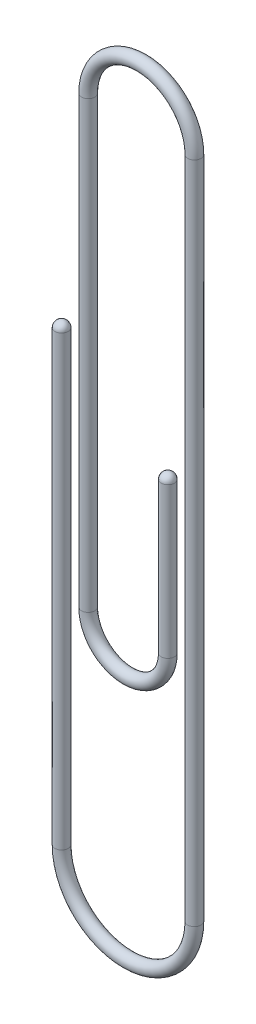
ISO-10303-21;
HEADER;
FILE_DESCRIPTION(('STEP AP214'),'2;1');
FILE_NAME('part.step','',(''),(''),'','','');
FILE_SCHEMA(('AUTOMOTIVE_DESIGN { 1 0 10303 214 1 1 1 1 }'));
ENDSEC;
DATA;
#1=APPLICATION_CONTEXT('core data for automotive mechanical design processes');
#2=APPLICATION_PROTOCOL_DEFINITION('international standard','automotive_design',2000,#1);
#3=PRODUCT_CONTEXT('',#1,'mechanical');
#4=PRODUCT('Part','Part','',(#3));
#5=PRODUCT_RELATED_PRODUCT_CATEGORY('part','',(#4));
#6=PRODUCT_DEFINITION_FORMATION('','',#4);
#7=PRODUCT_DEFINITION_CONTEXT('part definition',#1,'design');
#8=PRODUCT_DEFINITION('design','',#6,#7);
#9=PRODUCT_DEFINITION_SHAPE('','',#8);
#10=(LENGTH_UNIT() NAMED_UNIT(*) SI_UNIT(.MILLI.,.METRE.));
#11=(NAMED_UNIT(*) PLANE_ANGLE_UNIT() SI_UNIT($,.RADIAN.));
#12=(NAMED_UNIT(*) SI_UNIT($,.STERADIAN.) SOLID_ANGLE_UNIT());
#13=UNCERTAINTY_MEASURE_WITH_UNIT(LENGTH_MEASURE(1.E-05),#10,'distance_accuracy_value','');
#14=(GEOMETRIC_REPRESENTATION_CONTEXT(3) GLOBAL_UNCERTAINTY_ASSIGNED_CONTEXT((#13)) GLOBAL_UNIT_ASSIGNED_CONTEXT((#10,
#11,#12)) REPRESENTATION_CONTEXT('',''));
#15=CARTESIAN_POINT('',(0.,0.,0.));
#16=DIRECTION('',(0.,0.,1.));
#17=DIRECTION('',(1.,0.,0.));
#18=AXIS2_PLACEMENT_3D('',#15,#16,#17);
#19=CARTESIAN_POINT('',(-2.,-20.0269196464769,0.));
#20=DIRECTION('',(0.,-1.,0.));
#21=DIRECTION('',(0.,0.,-1.));
#22=AXIS2_PLACEMENT_3D('',#19,#20,#21);
#23=CYLINDRICAL_SURFACE('',#22,0.5);
#24=CARTESIAN_POINT('',(-2.,-20.5269196464769,0.));
#25=DIRECTION('',(0.,-1.,0.));
#26=DIRECTION('',(0.,0.,-1.));
#27=AXIS2_PLACEMENT_3D('',#24,#25,#26);
#28=CIRCLE('',#27,0.5);
#29=CARTESIAN_POINT('',(-2.,-20.5269196464769,-0.5));
#30=VERTEX_POINT('',#29);
#31=EDGE_CURVE('E56',#30,#30,#28,.T.);
#32=ORIENTED_EDGE('',*,*,#31,.T.);
#33=EDGE_LOOP('',(#32));
#34=FACE_BOUND('',#33,.T.);
#35=CARTESIAN_POINT('',(-2.,-31.8534014432822,0.));
#36=DIRECTION('',(0.,1.,0.));
#37=DIRECTION('',(0.,0.,-1.));
#38=AXIS2_PLACEMENT_3D('',#35,#36,#37);
#39=CIRCLE('',#38,0.5);
#40=CARTESIAN_POINT('',(-1.5,-31.8534014432822,0.));
#41=VERTEX_POINT('',#40);
#42=EDGE_CURVE('E78',#41,#41,#39,.T.);
#43=ORIENTED_EDGE('',*,*,#42,.T.);
#44=EDGE_LOOP('',(#43));
#45=FACE_BOUND('',#44,.T.);
#46=ADVANCED_FACE('F49',(#34,#45),#23,.T.);
#47=CARTESIAN_POINT('',(-5.,-31.8534014432822,0.));
#48=DIRECTION('',(0.,0.,-1.));
#49=DIRECTION('',(-1.,0.,0.));
#50=AXIS2_PLACEMENT_3D('',#47,#48,#49);
#51=TOROIDAL_SURFACE('',#50,3.,0.5);
#52=CARTESIAN_POINT('',(-8.,-31.8534014432822,0.));
#53=DIRECTION('',(0.,-1.,0.));
#54=DIRECTION('',(0.,0.,-1.));
#55=AXIS2_PLACEMENT_3D('',#52,#53,#54);
#56=CIRCLE('',#55,0.5);
#57=CARTESIAN_POINT('',(-8.5,-31.8534014432822,0.));
#58=VERTEX_POINT('',#57);
#59=EDGE_CURVE('E75',#58,#58,#56,.T.);
#60=CARTESIAN_POINT('',(-5.,-31.8534014432822,0.));
#61=DIRECTION('',(0.,0.,-1.));
#62=DIRECTION('',(-1.,0.,0.));
#63=AXIS2_PLACEMENT_3D('',#60,#61,#62);
#64=CIRCLE('',#63,3.5);
#65=EDGE_CURVE('',#41,#58,#64,.T.);
#66=ORIENTED_EDGE('',*,*,#42,.F.);
#67=ORIENTED_EDGE('',*,*,#59,.T.);
#68=ORIENTED_EDGE('',*,*,#65,.T.);
#69=ORIENTED_EDGE('',*,*,#65,.F.);
#70=EDGE_LOOP('',(#66,#68,#67,#69));
#71=FACE_BOUND('',#70,.T.);
#72=ADVANCED_FACE('F83',(#71),#51,.T.);
#73=CARTESIAN_POINT('',(-8.,-31.8534014432822,0.));
#74=DIRECTION('',(0.,1.,0.));
#75=DIRECTION('',(0.,0.,1.));
#76=AXIS2_PLACEMENT_3D('',#73,#74,#75);
#77=CYLINDRICAL_SURFACE('',#76,0.5);
#78=CARTESIAN_POINT('',(-8.,1.65157019315808,0.));
#79=DIRECTION('',(0.,-1.,0.));
#80=DIRECTION('',(0.,0.,-1.));
#81=AXIS2_PLACEMENT_3D('',#78,#79,#80);
#82=CIRCLE('',#81,0.5);
#83=CARTESIAN_POINT('',(-8.5,1.65157019315808,0.));
#84=VERTEX_POINT('',#83);
#85=EDGE_CURVE('E72',#84,#84,#82,.T.);
#86=ORIENTED_EDGE('',*,*,#85,.T.);
#87=EDGE_LOOP('',(#86));
#88=FACE_BOUND('',#87,.T.);
#89=ORIENTED_EDGE('',*,*,#59,.F.);
#90=EDGE_LOOP('',(#89));
#91=FACE_BOUND('',#90,.T.);
#92=ADVANCED_FACE('F85',(#88,#91),#77,.T.);
#93=CARTESIAN_POINT('',(-4.,1.65157019315808,0.));
#94=DIRECTION('',(0.,0.,-1.));
#95=DIRECTION('',(-1.,0.,0.));
#96=AXIS2_PLACEMENT_3D('',#93,#94,#95);
#97=TOROIDAL_SURFACE('',#96,4.,0.5);
#98=CARTESIAN_POINT('',(0.,1.65157019315808,0.));
#99=DIRECTION('',(0.,1.,0.));
#100=DIRECTION('',(0.,0.,-1.));
#101=AXIS2_PLACEMENT_3D('',#98,#99,#100);
#102=CIRCLE('',#101,0.5);
#103=CARTESIAN_POINT('',(0.500000000000004,1.65157019315808,0.));
#104=VERTEX_POINT('',#103);
#105=EDGE_CURVE('E69',#104,#104,#102,.T.);
#106=CARTESIAN_POINT('',(-4.,1.65157019315808,0.));
#107=DIRECTION('',(0.,0.,-1.));
#108=DIRECTION('',(-1.,0.,0.));
#109=AXIS2_PLACEMENT_3D('',#106,#107,#108);
#110=CIRCLE('',#109,4.5);
#111=EDGE_CURVE('',#84,#104,#110,.T.);
#112=ORIENTED_EDGE('',*,*,#85,.F.);
#113=ORIENTED_EDGE('',*,*,#105,.T.);
#114=ORIENTED_EDGE('',*,*,#111,.T.);
#115=ORIENTED_EDGE('',*,*,#111,.F.);
#116=EDGE_LOOP('',(#112,#114,#113,#115));
#117=FACE_BOUND('',#116,.T.);
#118=ADVANCED_FACE('F91',(#117),#97,.T.);
#119=CARTESIAN_POINT('',(0.,1.65157019315808,0.));
#120=DIRECTION('',(0.,-1.,0.));
#121=DIRECTION('',(1.,0.,0.));
#122=AXIS2_PLACEMENT_3D('',#119,#120,#121);
#123=CYLINDRICAL_SURFACE('',#122,0.5);
#124=CARTESIAN_POINT('',(0.,-48.3484298068419,0.));
#125=DIRECTION('',(0.,1.,0.));
#126=DIRECTION('',(0.,0.,-1.));
#127=AXIS2_PLACEMENT_3D('',#124,#125,#126);
#128=CIRCLE('',#127,0.5);
#129=CARTESIAN_POINT('',(0.500000000000007,-48.3484298068419,0.));
#130=VERTEX_POINT('',#129);
#131=EDGE_CURVE('E64',#130,#130,#128,.T.);
#132=ORIENTED_EDGE('',*,*,#131,.T.);
#133=EDGE_LOOP('',(#132));
#134=FACE_BOUND('',#133,.T.);
#135=ORIENTED_EDGE('',*,*,#105,.F.);
#136=EDGE_LOOP('',(#135));
#137=FACE_BOUND('',#136,.T.);
#138=ADVANCED_FACE('F107',(#134,#137),#123,.T.);
#139=CARTESIAN_POINT('',(-4.99999999999999,-48.3484298068419,0.));
#140=DIRECTION('',(0.,0.,-1.));
#141=DIRECTION('',(-1.,0.,0.));
#142=AXIS2_PLACEMENT_3D('',#139,#140,#141);
#143=TOROIDAL_SURFACE('',#142,5.,0.5);
#144=CARTESIAN_POINT('',(-9.99999999999999,-48.3484298068419,0.));
#145=DIRECTION('',(0.,-1.,0.));
#146=DIRECTION('',(0.,0.,-1.));
#147=AXIS2_PLACEMENT_3D('',#144,#145,#146);
#148=CIRCLE('',#147,0.5);
#149=CARTESIAN_POINT('',(-10.5,-48.3484298068419,0.));
#150=VERTEX_POINT('',#149);
#151=EDGE_CURVE('E60',#150,#150,#148,.T.);
#152=CARTESIAN_POINT('',(-4.99999999999999,-48.3484298068419,0.));
#153=DIRECTION('',(0.,0.,-1.));
#154=DIRECTION('',(-1.,0.,0.));
#155=AXIS2_PLACEMENT_3D('',#152,#153,#154);
#156=CIRCLE('',#155,5.5);
#157=EDGE_CURVE('',#130,#150,#156,.T.);
#158=ORIENTED_EDGE('',*,*,#131,.F.);
#159=ORIENTED_EDGE('',*,*,#151,.T.);
#160=ORIENTED_EDGE('',*,*,#157,.T.);
#161=ORIENTED_EDGE('',*,*,#157,.F.);
#162=EDGE_LOOP('',(#158,#160,#159,#161));
#163=FACE_BOUND('',#162,.T.);
#164=ADVANCED_FACE('F99',(#163),#143,.T.);
#165=CARTESIAN_POINT('',(-9.99999999999999,-48.3484298068419,0.));
#166=DIRECTION('',(0.,1.,0.));
#167=DIRECTION('',(0.,0.,1.));
#168=AXIS2_PLACEMENT_3D('',#165,#166,#167);
#169=CYLINDRICAL_SURFACE('',#168,0.5);
#170=CARTESIAN_POINT('',(-9.99999999999999,-14.6342086916424,0.));
#171=DIRECTION('',(0.,1.,0.));
#172=DIRECTION('',(0.,0.,1.));
#173=AXIS2_PLACEMENT_3D('',#170,#171,#172);
#174=CIRCLE('',#173,0.5);
#175=CARTESIAN_POINT('',(-9.99999999999999,-14.6342086916424,0.5));
#176=VERTEX_POINT('',#175);
#177=EDGE_CURVE('E11',#176,#176,#174,.F.);
#178=ORIENTED_EDGE('',*,*,#177,.T.);
#179=EDGE_LOOP('',(#178));
#180=FACE_BOUND('',#179,.T.);
#181=ORIENTED_EDGE('',*,*,#151,.F.);
#182=EDGE_LOOP('',(#181));
#183=FACE_BOUND('',#182,.T.);
#184=ADVANCED_FACE('F97',(#180,#183),#169,.T.);
#185=CARTESIAN_POINT('',(-2.,-20.5269196464769,0.));
#186=DIRECTION('',(0.,1.,0.));
#187=DIRECTION('',(0.,0.,1.));
#188=AXIS2_PLACEMENT_3D('',#185,#186,#187);
#189=SPHERICAL_SURFACE('',#188,0.5);
#190=ORIENTED_EDGE('',*,*,#31,.F.);
#191=EDGE_LOOP('',(#190));
#192=FACE_BOUND('',#191,.T.);
#193=ADVANCED_FACE('F96',(#192),#189,.T.);
#194=CARTESIAN_POINT('',(-9.99999999999999,-14.6342086916424,0.));
#195=DIRECTION('',(0.,-1.,0.));
#196=DIRECTION('',(0.,0.,-1.));
#197=AXIS2_PLACEMENT_3D('',#194,#195,#196);
#198=SPHERICAL_SURFACE('',#197,0.5);
#199=ORIENTED_EDGE('',*,*,#177,.F.);
#200=EDGE_LOOP('',(#199));
#201=FACE_BOUND('',#200,.T.);
#202=ADVANCED_FACE('F51',(#201),#198,.T.);
#203=CLOSED_SHELL('',(#46,#72,#92,#118,#138,#164,#184,#193,#202));
#204=MANIFOLD_SOLID_BREP('B2',#203);
#205=ADVANCED_BREP_SHAPE_REPRESENTATION('',(#18,#204),#14);
#206=SHAPE_DEFINITION_REPRESENTATION(#9,#205);
ENDSEC;
END-ISO-10303-21;
